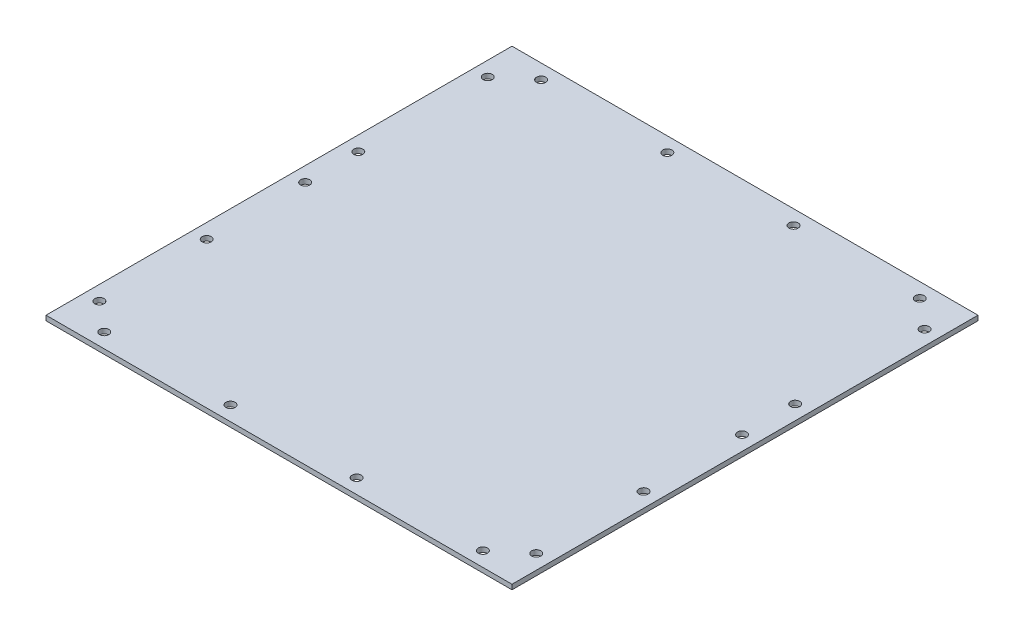
ISO-10303-21;
HEADER;
FILE_DESCRIPTION(('STEP AP214'),'2;1');
FILE_NAME('part.step','',(''),(''),'','','');
FILE_SCHEMA(('AUTOMOTIVE_DESIGN { 1 0 10303 214 1 1 1 1 }'));
ENDSEC;
DATA;
#1=APPLICATION_CONTEXT('core data for automotive mechanical design processes');
#2=APPLICATION_PROTOCOL_DEFINITION('international standard','automotive_design',2000,#1);
#3=PRODUCT_CONTEXT('',#1,'mechanical');
#4=PRODUCT('Part','Part','',(#3));
#5=PRODUCT_RELATED_PRODUCT_CATEGORY('part','',(#4));
#6=PRODUCT_DEFINITION_FORMATION('','',#4);
#7=PRODUCT_DEFINITION_CONTEXT('part definition',#1,'design');
#8=PRODUCT_DEFINITION('design','',#6,#7);
#9=PRODUCT_DEFINITION_SHAPE('','',#8);
#10=(LENGTH_UNIT() NAMED_UNIT(*) SI_UNIT(.MILLI.,.METRE.));
#11=(NAMED_UNIT(*) PLANE_ANGLE_UNIT() SI_UNIT($,.RADIAN.));
#12=(NAMED_UNIT(*) SI_UNIT($,.STERADIAN.) SOLID_ANGLE_UNIT());
#13=UNCERTAINTY_MEASURE_WITH_UNIT(LENGTH_MEASURE(1.E-05),#10,'distance_accuracy_value','');
#14=(GEOMETRIC_REPRESENTATION_CONTEXT(3) GLOBAL_UNCERTAINTY_ASSIGNED_CONTEXT((#13)) GLOBAL_UNIT_ASSIGNED_CONTEXT((#10,
#11,#12)) REPRESENTATION_CONTEXT('',''));
#15=CARTESIAN_POINT('',(0.,0.,0.));
#16=DIRECTION('',(0.,0.,1.));
#17=DIRECTION('',(1.,0.,0.));
#18=AXIS2_PLACEMENT_3D('',#15,#16,#17);
#19=CARTESIAN_POINT('',(138.1125,1.5875,-4.76250000000003));
#20=DIRECTION('',(0.,1.,0.));
#21=DIRECTION('',(0.,0.,1.));
#22=AXIS2_PLACEMENT_3D('',#19,#20,#21);
#23=CYLINDRICAL_SURFACE('',#22,1.5);
#24=CARTESIAN_POINT('',(138.1125,0.,-4.76250000000003));
#25=DIRECTION('',(0.,1.,0.));
#26=DIRECTION('',(0.,0.,1.));
#27=AXIS2_PLACEMENT_3D('',#24,#25,#26);
#28=CIRCLE('',#27,1.5);
#29=CARTESIAN_POINT('',(138.1125,0.,-3.26250000000003));
#30=VERTEX_POINT('',#29);
#31=EDGE_CURVE('E54',#30,#30,#28,.T.);
#32=ORIENTED_EDGE('',*,*,#31,.F.);
#33=EDGE_LOOP('',(#32));
#34=FACE_BOUND('',#33,.T.);
#35=CARTESIAN_POINT('',(138.1125,1.5875,-4.76250000000003));
#36=DIRECTION('',(0.,1.,0.));
#37=DIRECTION('',(0.,0.,1.));
#38=AXIS2_PLACEMENT_3D('',#35,#36,#37);
#39=CIRCLE('',#38,1.5);
#40=CARTESIAN_POINT('',(138.1125,1.5875,-3.26250000000003));
#41=VERTEX_POINT('',#40);
#42=EDGE_CURVE('E11',#41,#41,#39,.T.);
#43=ORIENTED_EDGE('',*,*,#42,.T.);
#44=EDGE_LOOP('',(#43));
#45=FACE_BOUND('',#44,.T.);
#46=ADVANCED_FACE('F45',(#34,#45),#23,.F.);
#47=CARTESIAN_POINT('',(96.8375,1.5875,-4.76250000000002));
#48=DIRECTION('',(0.,1.,0.));
#49=DIRECTION('',(0.,0.,1.));
#50=AXIS2_PLACEMENT_3D('',#47,#48,#49);
#51=CYLINDRICAL_SURFACE('',#50,1.5);
#52=CARTESIAN_POINT('',(96.8375,0.,-4.76250000000002));
#53=DIRECTION('',(0.,1.,0.));
#54=DIRECTION('',(0.,0.,1.));
#55=AXIS2_PLACEMENT_3D('',#52,#53,#54);
#56=CIRCLE('',#55,1.5);
#57=CARTESIAN_POINT('',(96.8375,0.,-3.26250000000002));
#58=VERTEX_POINT('',#57);
#59=EDGE_CURVE('E167',#58,#58,#56,.T.);
#60=ORIENTED_EDGE('',*,*,#59,.F.);
#61=EDGE_LOOP('',(#60));
#62=FACE_BOUND('',#61,.T.);
#63=CARTESIAN_POINT('',(96.8375,1.5875,-4.76250000000002));
#64=DIRECTION('',(0.,1.,0.));
#65=DIRECTION('',(0.,0.,1.));
#66=AXIS2_PLACEMENT_3D('',#63,#64,#65);
#67=CIRCLE('',#66,1.5);
#68=CARTESIAN_POINT('',(96.8375,1.5875,-3.26250000000002));
#69=VERTEX_POINT('',#68);
#70=EDGE_CURVE('E171',#69,#69,#67,.T.);
#71=ORIENTED_EDGE('',*,*,#70,.T.);
#72=EDGE_LOOP('',(#71));
#73=FACE_BOUND('',#72,.T.);
#74=ADVANCED_FACE('F182',(#62,#73),#51,.F.);
#75=CARTESIAN_POINT('',(138.1125,1.5875,-147.6375));
#76=DIRECTION('',(0.,1.,0.));
#77=DIRECTION('',(0.,0.,1.));
#78=AXIS2_PLACEMENT_3D('',#75,#76,#77);
#79=CYLINDRICAL_SURFACE('',#78,1.5);
#80=CARTESIAN_POINT('',(138.1125,0.,-147.6375));
#81=DIRECTION('',(0.,1.,0.));
#82=DIRECTION('',(0.,0.,1.));
#83=AXIS2_PLACEMENT_3D('',#80,#81,#82);
#84=CIRCLE('',#83,1.5);
#85=CARTESIAN_POINT('',(138.1125,0.,-146.1375));
#86=VERTEX_POINT('',#85);
#87=EDGE_CURVE('E159',#86,#86,#84,.T.);
#88=ORIENTED_EDGE('',*,*,#87,.F.);
#89=EDGE_LOOP('',(#88));
#90=FACE_BOUND('',#89,.T.);
#91=CARTESIAN_POINT('',(138.1125,1.5875,-147.6375));
#92=DIRECTION('',(0.,1.,0.));
#93=DIRECTION('',(0.,0.,1.));
#94=AXIS2_PLACEMENT_3D('',#91,#92,#93);
#95=CIRCLE('',#94,1.5);
#96=CARTESIAN_POINT('',(138.1125,1.5875,-146.1375));
#97=VERTEX_POINT('',#96);
#98=EDGE_CURVE('E163',#97,#97,#95,.T.);
#99=ORIENTED_EDGE('',*,*,#98,.T.);
#100=EDGE_LOOP('',(#99));
#101=FACE_BOUND('',#100,.T.);
#102=ADVANCED_FACE('F222',(#90,#101),#79,.F.);
#103=CARTESIAN_POINT('',(96.8375,1.5875,-147.6375));
#104=DIRECTION('',(0.,1.,0.));
#105=DIRECTION('',(0.,0.,1.));
#106=AXIS2_PLACEMENT_3D('',#103,#104,#105);
#107=CYLINDRICAL_SURFACE('',#106,1.5);
#108=CARTESIAN_POINT('',(96.8375,0.,-147.6375));
#109=DIRECTION('',(0.,1.,0.));
#110=DIRECTION('',(0.,0.,1.));
#111=AXIS2_PLACEMENT_3D('',#108,#109,#110);
#112=CIRCLE('',#111,1.5);
#113=CARTESIAN_POINT('',(96.8375,0.,-146.1375));
#114=VERTEX_POINT('',#113);
#115=EDGE_CURVE('E151',#114,#114,#112,.T.);
#116=ORIENTED_EDGE('',*,*,#115,.F.);
#117=EDGE_LOOP('',(#116));
#118=FACE_BOUND('',#117,.T.);
#119=CARTESIAN_POINT('',(96.8375,1.5875,-147.6375));
#120=DIRECTION('',(0.,1.,0.));
#121=DIRECTION('',(0.,0.,1.));
#122=AXIS2_PLACEMENT_3D('',#119,#120,#121);
#123=CIRCLE('',#122,1.5);
#124=CARTESIAN_POINT('',(96.8375,1.5875,-146.1375));
#125=VERTEX_POINT('',#124);
#126=EDGE_CURVE('E155',#125,#125,#123,.T.);
#127=ORIENTED_EDGE('',*,*,#126,.T.);
#128=EDGE_LOOP('',(#127));
#129=FACE_BOUND('',#128,.T.);
#130=ADVANCED_FACE('F218',(#118,#129),#107,.F.);
#131=CARTESIAN_POINT('',(147.6375,1.5875,-12.7));
#132=DIRECTION('',(0.,1.,0.));
#133=DIRECTION('',(0.,0.,1.));
#134=AXIS2_PLACEMENT_3D('',#131,#132,#133);
#135=CYLINDRICAL_SURFACE('',#134,1.5);
#136=CARTESIAN_POINT('',(147.6375,0.,-12.7));
#137=DIRECTION('',(0.,1.,0.));
#138=DIRECTION('',(0.,0.,1.));
#139=AXIS2_PLACEMENT_3D('',#136,#137,#138);
#140=CIRCLE('',#139,1.5);
#141=CARTESIAN_POINT('',(147.6375,0.,-11.2));
#142=VERTEX_POINT('',#141);
#143=EDGE_CURVE('E143',#142,#142,#140,.T.);
#144=ORIENTED_EDGE('',*,*,#143,.F.);
#145=EDGE_LOOP('',(#144));
#146=FACE_BOUND('',#145,.T.);
#147=CARTESIAN_POINT('',(147.6375,1.5875,-12.7));
#148=DIRECTION('',(0.,1.,0.));
#149=DIRECTION('',(0.,0.,1.));
#150=AXIS2_PLACEMENT_3D('',#147,#148,#149);
#151=CIRCLE('',#150,1.5);
#152=CARTESIAN_POINT('',(147.6375,1.5875,-11.2));
#153=VERTEX_POINT('',#152);
#154=EDGE_CURVE('E147',#153,#153,#151,.T.);
#155=ORIENTED_EDGE('',*,*,#154,.T.);
#156=EDGE_LOOP('',(#155));
#157=FACE_BOUND('',#156,.T.);
#158=ADVANCED_FACE('F214',(#146,#157),#135,.F.);
#159=CARTESIAN_POINT('',(4.7625,1.5875,-12.7));
#160=DIRECTION('',(0.,1.,0.));
#161=DIRECTION('',(0.,0.,1.));
#162=AXIS2_PLACEMENT_3D('',#159,#160,#161);
#163=CYLINDRICAL_SURFACE('',#162,1.5);
#164=CARTESIAN_POINT('',(4.7625,0.,-12.7));
#165=DIRECTION('',(0.,1.,0.));
#166=DIRECTION('',(0.,0.,1.));
#167=AXIS2_PLACEMENT_3D('',#164,#165,#166);
#168=CIRCLE('',#167,1.5);
#169=CARTESIAN_POINT('',(4.7625,0.,-11.2));
#170=VERTEX_POINT('',#169);
#171=EDGE_CURVE('E135',#170,#170,#168,.T.);
#172=ORIENTED_EDGE('',*,*,#171,.F.);
#173=EDGE_LOOP('',(#172));
#174=FACE_BOUND('',#173,.T.);
#175=CARTESIAN_POINT('',(4.7625,1.5875,-12.7));
#176=DIRECTION('',(0.,1.,0.));
#177=DIRECTION('',(0.,0.,1.));
#178=AXIS2_PLACEMENT_3D('',#175,#176,#177);
#179=CIRCLE('',#178,1.5);
#180=CARTESIAN_POINT('',(4.7625,1.5875,-11.2));
#181=VERTEX_POINT('',#180);
#182=EDGE_CURVE('E139',#181,#181,#179,.T.);
#183=ORIENTED_EDGE('',*,*,#182,.T.);
#184=EDGE_LOOP('',(#183));
#185=FACE_BOUND('',#184,.T.);
#186=ADVANCED_FACE('F210',(#174,#185),#163,.F.);
#187=CARTESIAN_POINT('',(0.,1.5875,-152.4));
#188=DIRECTION('',(1.,0.,0.));
#189=DIRECTION('',(0.,0.,-1.));
#190=AXIS2_PLACEMENT_3D('',#187,#188,#189);
#191=PLANE('',#190);
#192=DIRECTION('',(0.,0.,1.));
#193=VECTOR('',#192,1.);
#194=CARTESIAN_POINT('',(0.,0.,-152.4));
#195=LINE('',#194,#193);
#196=CARTESIAN_POINT('',(0.,0.,-152.4));
#197=VERTEX_POINT('',#196);
#198=CARTESIAN_POINT('',(0.,0.,0.));
#199=VERTEX_POINT('',#198);
#200=EDGE_CURVE('E118',#197,#199,#195,.T.);
#201=ORIENTED_EDGE('',*,*,#200,.T.);
#202=DIRECTION('',(0.,-1.,0.));
#203=VECTOR('',#202,1.);
#204=CARTESIAN_POINT('',(0.,1.5875,0.));
#205=LINE('',#204,#203);
#206=CARTESIAN_POINT('',(0.,1.5875,0.));
#207=VERTEX_POINT('',#206);
#208=EDGE_CURVE('E107',#207,#199,#205,.T.);
#209=ORIENTED_EDGE('',*,*,#208,.F.);
#210=DIRECTION('',(0.,0.,1.));
#211=VECTOR('',#210,1.);
#212=CARTESIAN_POINT('',(0.,1.5875,-152.4));
#213=LINE('',#212,#211);
#214=CARTESIAN_POINT('',(0.,1.5875,-152.4));
#215=VERTEX_POINT('',#214);
#216=EDGE_CURVE('E99',#215,#207,#213,.T.);
#217=ORIENTED_EDGE('',*,*,#216,.F.);
#218=DIRECTION('',(0.,-1.,0.));
#219=VECTOR('',#218,1.);
#220=CARTESIAN_POINT('',(0.,1.5875,-152.4));
#221=LINE('',#220,#219);
#222=EDGE_CURVE('E114',#215,#197,#221,.T.);
#223=ORIENTED_EDGE('',*,*,#222,.T.);
#224=EDGE_LOOP('',(#201,#209,#217,#223));
#225=FACE_BOUND('',#224,.T.);
#226=ADVANCED_FACE('F207',(#225),#191,.F.);
#227=CARTESIAN_POINT('',(0.,1.5875,0.));
#228=DIRECTION('',(0.,0.,-1.));
#229=DIRECTION('',(-1.,0.,0.));
#230=AXIS2_PLACEMENT_3D('',#227,#228,#229);
#231=PLANE('',#230);
#232=DIRECTION('',(1.,0.,0.));
#233=VECTOR('',#232,1.);
#234=CARTESIAN_POINT('',(0.,0.,0.));
#235=LINE('',#234,#233);
#236=CARTESIAN_POINT('',(152.4,0.,0.));
#237=VERTEX_POINT('',#236);
#238=EDGE_CURVE('E105',#199,#237,#235,.T.);
#239=ORIENTED_EDGE('',*,*,#238,.T.);
#240=DIRECTION('',(0.,-1.,0.));
#241=VECTOR('',#240,1.);
#242=CARTESIAN_POINT('',(152.4,1.5875,0.));
#243=LINE('',#242,#241);
#244=CARTESIAN_POINT('',(152.4,1.5875,0.));
#245=VERTEX_POINT('',#244);
#246=EDGE_CURVE('E103',#245,#237,#243,.T.);
#247=ORIENTED_EDGE('',*,*,#246,.F.);
#248=DIRECTION('',(1.,0.,0.));
#249=VECTOR('',#248,1.);
#250=CARTESIAN_POINT('',(0.,1.5875,0.));
#251=LINE('',#250,#249);
#252=EDGE_CURVE('E93',#207,#245,#251,.T.);
#253=ORIENTED_EDGE('',*,*,#252,.F.);
#254=ORIENTED_EDGE('',*,*,#208,.T.);
#255=EDGE_LOOP('',(#239,#247,#253,#254));
#256=FACE_BOUND('',#255,.T.);
#257=ADVANCED_FACE('F104',(#256),#231,.F.);
#258=CARTESIAN_POINT('',(152.4,1.5875,0.));
#259=DIRECTION('',(-1.,0.,0.));
#260=DIRECTION('',(0.,0.,1.));
#261=AXIS2_PLACEMENT_3D('',#258,#259,#260);
#262=PLANE('',#261);
#263=DIRECTION('',(0.,0.,-1.));
#264=VECTOR('',#263,1.);
#265=CARTESIAN_POINT('',(152.4,0.,0.));
#266=LINE('',#265,#264);
#267=CARTESIAN_POINT('',(152.4,0.,-152.4));
#268=VERTEX_POINT('',#267);
#269=EDGE_CURVE('E79',#237,#268,#266,.T.);
#270=ORIENTED_EDGE('',*,*,#269,.T.);
#271=DIRECTION('',(0.,-1.,0.));
#272=VECTOR('',#271,1.);
#273=CARTESIAN_POINT('',(152.4,1.5875,-152.4));
#274=LINE('',#273,#272);
#275=CARTESIAN_POINT('',(152.4,1.5875,-152.4));
#276=VERTEX_POINT('',#275);
#277=EDGE_CURVE('E108',#276,#268,#274,.T.);
#278=ORIENTED_EDGE('',*,*,#277,.F.);
#279=DIRECTION('',(0.,0.,-1.));
#280=VECTOR('',#279,1.);
#281=CARTESIAN_POINT('',(152.4,1.5875,0.));
#282=LINE('',#281,#280);
#283=EDGE_CURVE('E97',#245,#276,#282,.T.);
#284=ORIENTED_EDGE('',*,*,#283,.F.);
#285=ORIENTED_EDGE('',*,*,#246,.T.);
#286=EDGE_LOOP('',(#270,#278,#284,#285));
#287=FACE_BOUND('',#286,.T.);
#288=ADVANCED_FACE('F110',(#287),#262,.F.);
#289=CARTESIAN_POINT('',(152.4,1.5875,-152.4));
#290=DIRECTION('',(0.,0.,1.));
#291=DIRECTION('',(1.,0.,0.));
#292=AXIS2_PLACEMENT_3D('',#289,#290,#291);
#293=PLANE('',#292);
#294=DIRECTION('',(-1.,0.,0.));
#295=VECTOR('',#294,1.);
#296=CARTESIAN_POINT('',(152.4,0.,-152.4));
#297=LINE('',#296,#295);
#298=EDGE_CURVE('E85',#268,#197,#297,.T.);
#299=ORIENTED_EDGE('',*,*,#298,.T.);
#300=ORIENTED_EDGE('',*,*,#222,.F.);
#301=DIRECTION('',(-1.,0.,0.));
#302=VECTOR('',#301,1.);
#303=CARTESIAN_POINT('',(152.4,1.5875,-152.4));
#304=LINE('',#303,#302);
#305=EDGE_CURVE('E62',#276,#215,#304,.T.);
#306=ORIENTED_EDGE('',*,*,#305,.F.);
#307=ORIENTED_EDGE('',*,*,#277,.T.);
#308=EDGE_LOOP('',(#299,#300,#306,#307));
#309=FACE_BOUND('',#308,.T.);
#310=ADVANCED_FACE('F186',(#309),#293,.F.);
#311=CARTESIAN_POINT('',(0.,1.5875,0.));
#312=DIRECTION('',(0.,1.,0.));
#313=DIRECTION('',(0.,0.,1.));
#314=AXIS2_PLACEMENT_3D('',#311,#312,#313);
#315=PLANE('',#314);
#316=CARTESIAN_POINT('',(4.7625,1.5875,-47.79));
#317=DIRECTION('',(0.,1.,0.));
#318=DIRECTION('',(0.,0.,1.));
#319=AXIS2_PLACEMENT_3D('',#316,#317,#318);
#320=CIRCLE('',#319,1.49999999999999);
#321=CARTESIAN_POINT('',(4.7625,1.5875,-46.29));
#322=VERTEX_POINT('',#321);
#323=EDGE_CURVE('E454',#322,#322,#320,.T.);
#324=ORIENTED_EDGE('',*,*,#323,.F.);
#325=EDGE_LOOP('',(#324));
#326=FACE_BOUND('',#325,.T.);
#327=CARTESIAN_POINT('',(4.7625,1.5875,-80.));
#328=DIRECTION('',(0.,1.,0.));
#329=DIRECTION('',(0.,0.,1.));
#330=AXIS2_PLACEMENT_3D('',#327,#328,#329);
#331=CIRCLE('',#330,1.49999999999999);
#332=CARTESIAN_POINT('',(4.7625,1.5875,-78.5));
#333=VERTEX_POINT('',#332);
#334=EDGE_CURVE('E446',#333,#333,#331,.T.);
#335=ORIENTED_EDGE('',*,*,#334,.F.);
#336=EDGE_LOOP('',(#335));
#337=FACE_BOUND('',#336,.T.);
#338=CARTESIAN_POINT('',(147.6375,1.5875,-47.79));
#339=DIRECTION('',(0.,1.,0.));
#340=DIRECTION('',(0.,0.,1.));
#341=AXIS2_PLACEMENT_3D('',#338,#339,#340);
#342=CIRCLE('',#341,1.49999999999997);
#343=CARTESIAN_POINT('',(147.6375,1.5875,-46.29));
#344=VERTEX_POINT('',#343);
#345=EDGE_CURVE('E438',#344,#344,#342,.T.);
#346=ORIENTED_EDGE('',*,*,#345,.F.);
#347=EDGE_LOOP('',(#346));
#348=FACE_BOUND('',#347,.T.);
#349=CARTESIAN_POINT('',(147.6375,1.5875,-80.));
#350=DIRECTION('',(0.,1.,0.));
#351=DIRECTION('',(0.,0.,1.));
#352=AXIS2_PLACEMENT_3D('',#349,#350,#351);
#353=CIRCLE('',#352,1.49999999999997);
#354=CARTESIAN_POINT('',(147.6375,1.5875,-78.5));
#355=VERTEX_POINT('',#354);
#356=EDGE_CURVE('E430',#355,#355,#353,.T.);
#357=ORIENTED_EDGE('',*,*,#356,.F.);
#358=EDGE_LOOP('',(#357));
#359=FACE_BOUND('',#358,.T.);
#360=CARTESIAN_POINT('',(55.5625,1.5875,-4.76250000000001));
#361=DIRECTION('',(0.,1.,0.));
#362=DIRECTION('',(0.,0.,1.));
#363=AXIS2_PLACEMENT_3D('',#360,#361,#362);
#364=CIRCLE('',#363,1.5);
#365=CARTESIAN_POINT('',(55.5625,1.5875,-3.26250000000001));
#366=VERTEX_POINT('',#365);
#367=EDGE_CURVE('E418',#366,#366,#364,.T.);
#368=ORIENTED_EDGE('',*,*,#367,.F.);
#369=EDGE_LOOP('',(#368));
#370=FACE_BOUND('',#369,.T.);
#371=CARTESIAN_POINT('',(55.5625,1.5875,-147.6375));
#372=DIRECTION('',(0.,1.,0.));
#373=DIRECTION('',(0.,0.,1.));
#374=AXIS2_PLACEMENT_3D('',#371,#372,#373);
#375=CIRCLE('',#374,1.5);
#376=CARTESIAN_POINT('',(55.5625,1.5875,-146.1375));
#377=VERTEX_POINT('',#376);
#378=EDGE_CURVE('E410',#377,#377,#375,.T.);
#379=ORIENTED_EDGE('',*,*,#378,.F.);
#380=EDGE_LOOP('',(#379));
#381=FACE_BOUND('',#380,.T.);
#382=CARTESIAN_POINT('',(147.6375,1.5875,-97.3666666666667));
#383=DIRECTION('',(0.,1.,0.));
#384=DIRECTION('',(0.,0.,1.));
#385=AXIS2_PLACEMENT_3D('',#382,#383,#384);
#386=CIRCLE('',#385,1.5);
#387=CARTESIAN_POINT('',(147.6375,1.5875,-95.8666666666667));
#388=VERTEX_POINT('',#387);
#389=EDGE_CURVE('E402',#388,#388,#386,.T.);
#390=ORIENTED_EDGE('',*,*,#389,.F.);
#391=EDGE_LOOP('',(#390));
#392=FACE_BOUND('',#391,.T.);
#393=CARTESIAN_POINT('',(4.7625,1.5875,-97.3666666666667));
#394=DIRECTION('',(0.,1.,0.));
#395=DIRECTION('',(0.,0.,1.));
#396=AXIS2_PLACEMENT_3D('',#393,#394,#395);
#397=CIRCLE('',#396,1.5);
#398=CARTESIAN_POINT('',(4.7625,1.5875,-95.8666666666667));
#399=VERTEX_POINT('',#398);
#400=EDGE_CURVE('E394',#399,#399,#397,.T.);
#401=ORIENTED_EDGE('',*,*,#400,.F.);
#402=EDGE_LOOP('',(#401));
#403=FACE_BOUND('',#402,.T.);
#404=CARTESIAN_POINT('',(4.7625,1.5875,-139.7));
#405=DIRECTION('',(0.,1.,0.));
#406=DIRECTION('',(0.,0.,1.));
#407=AXIS2_PLACEMENT_3D('',#404,#405,#406);
#408=CIRCLE('',#407,1.5);
#409=CARTESIAN_POINT('',(4.7625,1.5875,-138.2));
#410=VERTEX_POINT('',#409);
#411=EDGE_CURVE('E390',#410,#410,#408,.T.);
#412=ORIENTED_EDGE('',*,*,#411,.F.);
#413=EDGE_LOOP('',(#412));
#414=FACE_BOUND('',#413,.T.);
#415=CARTESIAN_POINT('',(147.6375,1.5875,-139.7));
#416=DIRECTION('',(0.,1.,0.));
#417=DIRECTION('',(0.,0.,1.));
#418=AXIS2_PLACEMENT_3D('',#415,#416,#417);
#419=CIRCLE('',#418,1.5);
#420=CARTESIAN_POINT('',(147.6375,1.5875,-138.2));
#421=VERTEX_POINT('',#420);
#422=EDGE_CURVE('E347',#421,#421,#419,.T.);
#423=ORIENTED_EDGE('',*,*,#422,.F.);
#424=EDGE_LOOP('',(#423));
#425=FACE_BOUND('',#424,.T.);
#426=CARTESIAN_POINT('',(14.2875,1.5875,-147.6375));
#427=DIRECTION('',(0.,1.,0.));
#428=DIRECTION('',(0.,0.,1.));
#429=AXIS2_PLACEMENT_3D('',#426,#427,#428);
#430=CIRCLE('',#429,1.5);
#431=CARTESIAN_POINT('',(14.2875,1.5875,-146.1375));
#432=VERTEX_POINT('',#431);
#433=EDGE_CURVE('E337',#432,#432,#430,.T.);
#434=ORIENTED_EDGE('',*,*,#433,.F.);
#435=EDGE_LOOP('',(#434));
#436=FACE_BOUND('',#435,.T.);
#437=CARTESIAN_POINT('',(14.2875,1.5875,-4.7625));
#438=DIRECTION('',(0.,1.,0.));
#439=DIRECTION('',(0.,0.,1.));
#440=AXIS2_PLACEMENT_3D('',#437,#438,#439);
#441=CIRCLE('',#440,1.5);
#442=CARTESIAN_POINT('',(14.2875,1.5875,-3.2625));
#443=VERTEX_POINT('',#442);
#444=EDGE_CURVE('E344',#443,#443,#441,.T.);
#445=ORIENTED_EDGE('',*,*,#444,.F.);
#446=EDGE_LOOP('',(#445));
#447=FACE_BOUND('',#446,.T.);
#448=ORIENTED_EDGE('',*,*,#216,.T.);
#449=ORIENTED_EDGE('',*,*,#252,.T.);
#450=ORIENTED_EDGE('',*,*,#283,.T.);
#451=ORIENTED_EDGE('',*,*,#305,.T.);
#452=EDGE_LOOP('',(#448,#449,#450,#451));
#453=FACE_BOUND('',#452,.T.);
#454=ORIENTED_EDGE('',*,*,#182,.F.);
#455=EDGE_LOOP('',(#454));
#456=FACE_BOUND('',#455,.T.);
#457=ORIENTED_EDGE('',*,*,#154,.F.);
#458=EDGE_LOOP('',(#457));
#459=FACE_BOUND('',#458,.T.);
#460=ORIENTED_EDGE('',*,*,#126,.F.);
#461=EDGE_LOOP('',(#460));
#462=FACE_BOUND('',#461,.T.);
#463=ORIENTED_EDGE('',*,*,#98,.F.);
#464=EDGE_LOOP('',(#463));
#465=FACE_BOUND('',#464,.T.);
#466=ORIENTED_EDGE('',*,*,#70,.F.);
#467=EDGE_LOOP('',(#466));
#468=FACE_BOUND('',#467,.T.);
#469=ORIENTED_EDGE('',*,*,#42,.F.);
#470=EDGE_LOOP('',(#469));
#471=FACE_BOUND('',#470,.T.);
#472=ADVANCED_FACE('F94',(#326,#337,#348,#359,#370,#381,#392,#403,#414,#425,#436,#447,#453,#456,
#459,#462,#465,#468,#471),#315,.T.);
#473=CARTESIAN_POINT('',(0.,0.,0.));
#474=DIRECTION('',(0.,1.,0.));
#475=DIRECTION('',(0.,0.,1.));
#476=AXIS2_PLACEMENT_3D('',#473,#474,#475);
#477=PLANE('',#476);
#478=CARTESIAN_POINT('',(4.7625,0.,-47.79));
#479=DIRECTION('',(0.,1.,0.));
#480=DIRECTION('',(0.,0.,1.));
#481=AXIS2_PLACEMENT_3D('',#478,#479,#480);
#482=CIRCLE('',#481,1.5);
#483=CARTESIAN_POINT('',(4.7625,0.,-46.29));
#484=VERTEX_POINT('',#483);
#485=EDGE_CURVE('E450',#484,#484,#482,.T.);
#486=ORIENTED_EDGE('',*,*,#485,.T.);
#487=EDGE_LOOP('',(#486));
#488=FACE_BOUND('',#487,.T.);
#489=CARTESIAN_POINT('',(4.7625,0.,-80.));
#490=DIRECTION('',(0.,1.,0.));
#491=DIRECTION('',(0.,0.,1.));
#492=AXIS2_PLACEMENT_3D('',#489,#490,#491);
#493=CIRCLE('',#492,1.5);
#494=CARTESIAN_POINT('',(4.7625,0.,-78.5));
#495=VERTEX_POINT('',#494);
#496=EDGE_CURVE('E442',#495,#495,#493,.T.);
#497=ORIENTED_EDGE('',*,*,#496,.T.);
#498=EDGE_LOOP('',(#497));
#499=FACE_BOUND('',#498,.T.);
#500=CARTESIAN_POINT('',(147.6375,0.,-47.79));
#501=DIRECTION('',(0.,1.,0.));
#502=DIRECTION('',(0.,0.,1.));
#503=AXIS2_PLACEMENT_3D('',#500,#501,#502);
#504=CIRCLE('',#503,1.5);
#505=CARTESIAN_POINT('',(147.6375,0.,-46.29));
#506=VERTEX_POINT('',#505);
#507=EDGE_CURVE('E434',#506,#506,#504,.T.);
#508=ORIENTED_EDGE('',*,*,#507,.T.);
#509=EDGE_LOOP('',(#508));
#510=FACE_BOUND('',#509,.T.);
#511=CARTESIAN_POINT('',(147.6375,0.,-80.));
#512=DIRECTION('',(0.,1.,0.));
#513=DIRECTION('',(0.,0.,1.));
#514=AXIS2_PLACEMENT_3D('',#511,#512,#513);
#515=CIRCLE('',#514,1.5);
#516=CARTESIAN_POINT('',(147.6375,0.,-78.5));
#517=VERTEX_POINT('',#516);
#518=EDGE_CURVE('E426',#517,#517,#515,.T.);
#519=ORIENTED_EDGE('',*,*,#518,.T.);
#520=EDGE_LOOP('',(#519));
#521=FACE_BOUND('',#520,.T.);
#522=CARTESIAN_POINT('',(55.5625,0.,-4.76250000000001));
#523=DIRECTION('',(0.,1.,0.));
#524=DIRECTION('',(0.,0.,1.));
#525=AXIS2_PLACEMENT_3D('',#522,#523,#524);
#526=CIRCLE('',#525,1.5);
#527=CARTESIAN_POINT('',(55.5625,0.,-3.26250000000001));
#528=VERTEX_POINT('',#527);
#529=EDGE_CURVE('E422',#528,#528,#526,.T.);
#530=ORIENTED_EDGE('',*,*,#529,.T.);
#531=EDGE_LOOP('',(#530));
#532=FACE_BOUND('',#531,.T.);
#533=CARTESIAN_POINT('',(55.5625,0.,-147.6375));
#534=DIRECTION('',(0.,1.,0.));
#535=DIRECTION('',(0.,0.,1.));
#536=AXIS2_PLACEMENT_3D('',#533,#534,#535);
#537=CIRCLE('',#536,1.5);
#538=CARTESIAN_POINT('',(55.5625,0.,-146.1375));
#539=VERTEX_POINT('',#538);
#540=EDGE_CURVE('E414',#539,#539,#537,.T.);
#541=ORIENTED_EDGE('',*,*,#540,.T.);
#542=EDGE_LOOP('',(#541));
#543=FACE_BOUND('',#542,.T.);
#544=CARTESIAN_POINT('',(147.6375,0.,-97.3666666666667));
#545=DIRECTION('',(0.,1.,0.));
#546=DIRECTION('',(0.,0.,1.));
#547=AXIS2_PLACEMENT_3D('',#544,#545,#546);
#548=CIRCLE('',#547,1.5);
#549=CARTESIAN_POINT('',(147.6375,0.,-95.8666666666667));
#550=VERTEX_POINT('',#549);
#551=EDGE_CURVE('E406',#550,#550,#548,.T.);
#552=ORIENTED_EDGE('',*,*,#551,.T.);
#553=EDGE_LOOP('',(#552));
#554=FACE_BOUND('',#553,.T.);
#555=CARTESIAN_POINT('',(4.7625,0.,-97.3666666666667));
#556=DIRECTION('',(0.,1.,0.));
#557=DIRECTION('',(0.,0.,1.));
#558=AXIS2_PLACEMENT_3D('',#555,#556,#557);
#559=CIRCLE('',#558,1.5);
#560=CARTESIAN_POINT('',(4.7625,0.,-95.8666666666667));
#561=VERTEX_POINT('',#560);
#562=EDGE_CURVE('E398',#561,#561,#559,.T.);
#563=ORIENTED_EDGE('',*,*,#562,.T.);
#564=EDGE_LOOP('',(#563));
#565=FACE_BOUND('',#564,.T.);
#566=CARTESIAN_POINT('',(4.7625,0.,-139.7));
#567=DIRECTION('',(0.,1.,0.));
#568=DIRECTION('',(0.,0.,1.));
#569=AXIS2_PLACEMENT_3D('',#566,#567,#568);
#570=CIRCLE('',#569,1.5);
#571=CARTESIAN_POINT('',(4.7625,0.,-138.2));
#572=VERTEX_POINT('',#571);
#573=EDGE_CURVE('E386',#572,#572,#570,.T.);
#574=ORIENTED_EDGE('',*,*,#573,.T.);
#575=EDGE_LOOP('',(#574));
#576=FACE_BOUND('',#575,.T.);
#577=CARTESIAN_POINT('',(147.6375,0.,-139.7));
#578=DIRECTION('',(0.,1.,0.));
#579=DIRECTION('',(0.,0.,1.));
#580=AXIS2_PLACEMENT_3D('',#577,#578,#579);
#581=CIRCLE('',#580,1.5);
#582=CARTESIAN_POINT('',(147.6375,0.,-138.2));
#583=VERTEX_POINT('',#582);
#584=EDGE_CURVE('E340',#583,#583,#581,.T.);
#585=ORIENTED_EDGE('',*,*,#584,.T.);
#586=EDGE_LOOP('',(#585));
#587=FACE_BOUND('',#586,.T.);
#588=CARTESIAN_POINT('',(14.2875,0.,-147.6375));
#589=DIRECTION('',(0.,1.,0.));
#590=DIRECTION('',(0.,0.,1.));
#591=AXIS2_PLACEMENT_3D('',#588,#589,#590);
#592=CIRCLE('',#591,1.5);
#593=CARTESIAN_POINT('',(14.2875,0.,-146.1375));
#594=VERTEX_POINT('',#593);
#595=EDGE_CURVE('E334',#594,#594,#592,.T.);
#596=ORIENTED_EDGE('',*,*,#595,.T.);
#597=EDGE_LOOP('',(#596));
#598=FACE_BOUND('',#597,.T.);
#599=CARTESIAN_POINT('',(14.2875,0.,-4.7625));
#600=DIRECTION('',(0.,1.,0.));
#601=DIRECTION('',(0.,0.,1.));
#602=AXIS2_PLACEMENT_3D('',#599,#600,#601);
#603=CIRCLE('',#602,1.5);
#604=CARTESIAN_POINT('',(14.2875,0.,-3.2625));
#605=VERTEX_POINT('',#604);
#606=EDGE_CURVE('E122',#605,#605,#603,.T.);
#607=ORIENTED_EDGE('',*,*,#606,.T.);
#608=EDGE_LOOP('',(#607));
#609=FACE_BOUND('',#608,.T.);
#610=ORIENTED_EDGE('',*,*,#200,.F.);
#611=ORIENTED_EDGE('',*,*,#298,.F.);
#612=ORIENTED_EDGE('',*,*,#269,.F.);
#613=ORIENTED_EDGE('',*,*,#238,.F.);
#614=EDGE_LOOP('',(#610,#611,#612,#613));
#615=FACE_BOUND('',#614,.T.);
#616=ORIENTED_EDGE('',*,*,#171,.T.);
#617=EDGE_LOOP('',(#616));
#618=FACE_BOUND('',#617,.T.);
#619=ORIENTED_EDGE('',*,*,#143,.T.);
#620=EDGE_LOOP('',(#619));
#621=FACE_BOUND('',#620,.T.);
#622=ORIENTED_EDGE('',*,*,#115,.T.);
#623=EDGE_LOOP('',(#622));
#624=FACE_BOUND('',#623,.T.);
#625=ORIENTED_EDGE('',*,*,#87,.T.);
#626=EDGE_LOOP('',(#625));
#627=FACE_BOUND('',#626,.T.);
#628=ORIENTED_EDGE('',*,*,#59,.T.);
#629=EDGE_LOOP('',(#628));
#630=FACE_BOUND('',#629,.T.);
#631=ORIENTED_EDGE('',*,*,#31,.T.);
#632=EDGE_LOOP('',(#631));
#633=FACE_BOUND('',#632,.T.);
#634=ADVANCED_FACE('F178',(#488,#499,#510,#521,#532,#543,#554,#565,#576,#587,#598,#609,#615,
#618,#621,#624,#627,#630,#633),#477,.F.);
#635=CARTESIAN_POINT('',(14.2875,1.5875,-4.7625));
#636=DIRECTION('',(0.,1.,0.));
#637=DIRECTION('',(0.,0.,1.));
#638=AXIS2_PLACEMENT_3D('',#635,#636,#637);
#639=CYLINDRICAL_SURFACE('',#638,1.5);
#640=ORIENTED_EDGE('',*,*,#606,.F.);
#641=EDGE_LOOP('',(#640));
#642=FACE_BOUND('',#641,.T.);
#643=ORIENTED_EDGE('',*,*,#444,.T.);
#644=EDGE_LOOP('',(#643));
#645=FACE_BOUND('',#644,.T.);
#646=ADVANCED_FACE('F193',(#642,#645),#639,.F.);
#647=CARTESIAN_POINT('',(14.2875,1.5875,-147.6375));
#648=DIRECTION('',(0.,1.,0.));
#649=DIRECTION('',(0.,0.,1.));
#650=AXIS2_PLACEMENT_3D('',#647,#648,#649);
#651=CYLINDRICAL_SURFACE('',#650,1.5);
#652=ORIENTED_EDGE('',*,*,#595,.F.);
#653=EDGE_LOOP('',(#652));
#654=FACE_BOUND('',#653,.T.);
#655=ORIENTED_EDGE('',*,*,#433,.T.);
#656=EDGE_LOOP('',(#655));
#657=FACE_BOUND('',#656,.T.);
#658=ADVANCED_FACE('F323',(#654,#657),#651,.F.);
#659=CARTESIAN_POINT('',(147.6375,1.5875,-139.7));
#660=DIRECTION('',(0.,1.,0.));
#661=DIRECTION('',(0.,0.,1.));
#662=AXIS2_PLACEMENT_3D('',#659,#660,#661);
#663=CYLINDRICAL_SURFACE('',#662,1.5);
#664=ORIENTED_EDGE('',*,*,#584,.F.);
#665=EDGE_LOOP('',(#664));
#666=FACE_BOUND('',#665,.T.);
#667=ORIENTED_EDGE('',*,*,#422,.T.);
#668=EDGE_LOOP('',(#667));
#669=FACE_BOUND('',#668,.T.);
#670=ADVANCED_FACE('F320',(#666,#669),#663,.F.);
#671=CARTESIAN_POINT('',(4.7625,1.5875,-139.7));
#672=DIRECTION('',(0.,1.,0.));
#673=DIRECTION('',(0.,0.,1.));
#674=AXIS2_PLACEMENT_3D('',#671,#672,#673);
#675=CYLINDRICAL_SURFACE('',#674,1.5);
#676=ORIENTED_EDGE('',*,*,#573,.F.);
#677=EDGE_LOOP('',(#676));
#678=FACE_BOUND('',#677,.T.);
#679=ORIENTED_EDGE('',*,*,#411,.T.);
#680=EDGE_LOOP('',(#679));
#681=FACE_BOUND('',#680,.T.);
#682=ADVANCED_FACE('F316',(#678,#681),#675,.F.);
#683=CARTESIAN_POINT('',(4.7625,1.5875,-97.3666666666667));
#684=DIRECTION('',(0.,1.,0.));
#685=DIRECTION('',(0.,0.,1.));
#686=AXIS2_PLACEMENT_3D('',#683,#684,#685);
#687=CYLINDRICAL_SURFACE('',#686,1.5);
#688=ORIENTED_EDGE('',*,*,#562,.F.);
#689=EDGE_LOOP('',(#688));
#690=FACE_BOUND('',#689,.T.);
#691=ORIENTED_EDGE('',*,*,#400,.T.);
#692=EDGE_LOOP('',(#691));
#693=FACE_BOUND('',#692,.T.);
#694=ADVANCED_FACE('F312',(#690,#693),#687,.F.);
#695=CARTESIAN_POINT('',(147.6375,1.5875,-97.3666666666667));
#696=DIRECTION('',(0.,1.,0.));
#697=DIRECTION('',(0.,0.,1.));
#698=AXIS2_PLACEMENT_3D('',#695,#696,#697);
#699=CYLINDRICAL_SURFACE('',#698,1.5);
#700=ORIENTED_EDGE('',*,*,#551,.F.);
#701=EDGE_LOOP('',(#700));
#702=FACE_BOUND('',#701,.T.);
#703=ORIENTED_EDGE('',*,*,#389,.T.);
#704=EDGE_LOOP('',(#703));
#705=FACE_BOUND('',#704,.T.);
#706=ADVANCED_FACE('F257',(#702,#705),#699,.F.);
#707=CARTESIAN_POINT('',(55.5625,1.5875,-147.6375));
#708=DIRECTION('',(0.,1.,0.));
#709=DIRECTION('',(0.,0.,1.));
#710=AXIS2_PLACEMENT_3D('',#707,#708,#709);
#711=CYLINDRICAL_SURFACE('',#710,1.5);
#712=ORIENTED_EDGE('',*,*,#540,.F.);
#713=EDGE_LOOP('',(#712));
#714=FACE_BOUND('',#713,.T.);
#715=ORIENTED_EDGE('',*,*,#378,.T.);
#716=EDGE_LOOP('',(#715));
#717=FACE_BOUND('',#716,.T.);
#718=ADVANCED_FACE('F253',(#714,#717),#711,.F.);
#719=CARTESIAN_POINT('',(55.5625,1.5875,-4.76250000000001));
#720=DIRECTION('',(0.,1.,0.));
#721=DIRECTION('',(0.,0.,1.));
#722=AXIS2_PLACEMENT_3D('',#719,#720,#721);
#723=CYLINDRICAL_SURFACE('',#722,1.5);
#724=ORIENTED_EDGE('',*,*,#529,.F.);
#725=EDGE_LOOP('',(#724));
#726=FACE_BOUND('',#725,.T.);
#727=ORIENTED_EDGE('',*,*,#367,.T.);
#728=EDGE_LOOP('',(#727));
#729=FACE_BOUND('',#728,.T.);
#730=ADVANCED_FACE('F256',(#726,#729),#723,.F.);
#731=CARTESIAN_POINT('',(147.6375,1.5875,-80.));
#732=DIRECTION('',(0.,1.,0.));
#733=DIRECTION('',(0.,0.,1.));
#734=AXIS2_PLACEMENT_3D('',#731,#732,#733);
#735=CYLINDRICAL_SURFACE('',#734,1.49999999999999);
#736=ORIENTED_EDGE('',*,*,#518,.F.);
#737=EDGE_LOOP('',(#736));
#738=FACE_BOUND('',#737,.T.);
#739=ORIENTED_EDGE('',*,*,#356,.T.);
#740=EDGE_LOOP('',(#739));
#741=FACE_BOUND('',#740,.T.);
#742=ADVANCED_FACE('F266',(#738,#741),#735,.F.);
#743=CARTESIAN_POINT('',(147.6375,1.5875,-47.79));
#744=DIRECTION('',(0.,1.,0.));
#745=DIRECTION('',(0.,0.,1.));
#746=AXIS2_PLACEMENT_3D('',#743,#744,#745);
#747=CYLINDRICAL_SURFACE('',#746,1.49999999999999);
#748=ORIENTED_EDGE('',*,*,#507,.F.);
#749=EDGE_LOOP('',(#748));
#750=FACE_BOUND('',#749,.T.);
#751=ORIENTED_EDGE('',*,*,#345,.T.);
#752=EDGE_LOOP('',(#751));
#753=FACE_BOUND('',#752,.T.);
#754=ADVANCED_FACE('F274',(#750,#753),#747,.F.);
#755=CARTESIAN_POINT('',(4.7625,1.5875,-80.));
#756=DIRECTION('',(0.,1.,0.));
#757=DIRECTION('',(0.,0.,1.));
#758=AXIS2_PLACEMENT_3D('',#755,#756,#757);
#759=CYLINDRICAL_SURFACE('',#758,1.49999999999999);
#760=ORIENTED_EDGE('',*,*,#496,.F.);
#761=EDGE_LOOP('',(#760));
#762=FACE_BOUND('',#761,.T.);
#763=ORIENTED_EDGE('',*,*,#334,.T.);
#764=EDGE_LOOP('',(#763));
#765=FACE_BOUND('',#764,.T.);
#766=ADVANCED_FACE('F282',(#762,#765),#759,.F.);
#767=CARTESIAN_POINT('',(4.7625,1.5875,-47.79));
#768=DIRECTION('',(0.,1.,0.));
#769=DIRECTION('',(0.,0.,1.));
#770=AXIS2_PLACEMENT_3D('',#767,#768,#769);
#771=CYLINDRICAL_SURFACE('',#770,1.49999999999999);
#772=ORIENTED_EDGE('',*,*,#485,.F.);
#773=EDGE_LOOP('',(#772));
#774=FACE_BOUND('',#773,.T.);
#775=ORIENTED_EDGE('',*,*,#323,.T.);
#776=EDGE_LOOP('',(#775));
#777=FACE_BOUND('',#776,.T.);
#778=ADVANCED_FACE('F295',(#774,#777),#771,.F.);
#779=CLOSED_SHELL('',(#46,#74,#102,#130,#158,#186,#226,#257,#288,#310,#472,#634,#646,#658,#670,
#682,#694,#706,#718,#730,#742,#754,#766,#778));
#780=MANIFOLD_SOLID_BREP('B2',#779);
#781=ADVANCED_BREP_SHAPE_REPRESENTATION('',(#18,#780),#14);
#782=SHAPE_DEFINITION_REPRESENTATION(#9,#781);
ENDSEC;
END-ISO-10303-21;
